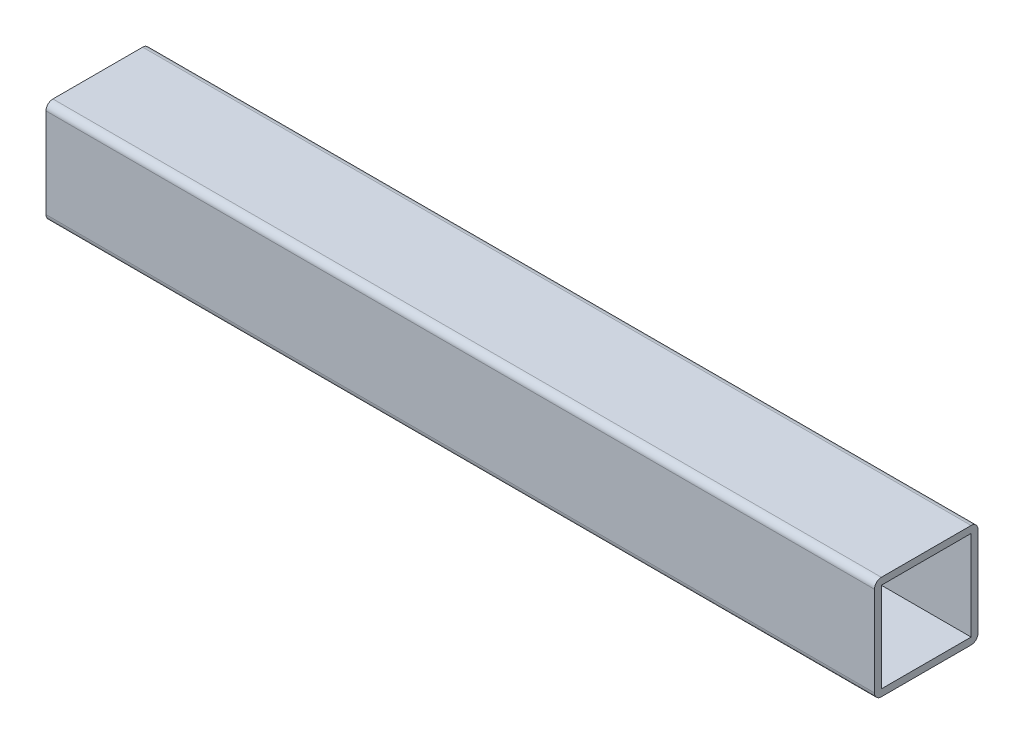
ISO-10303-21;
HEADER;
FILE_DESCRIPTION(('STEP AP214'),'2;1');
FILE_NAME('part.step','',(''),(''),'','','');
FILE_SCHEMA(('AUTOMOTIVE_DESIGN { 1 0 10303 214 1 1 1 1 }'));
ENDSEC;
DATA;
#1=APPLICATION_CONTEXT('core data for automotive mechanical design processes');
#2=APPLICATION_PROTOCOL_DEFINITION('international standard','automotive_design',2000,#1);
#3=PRODUCT_CONTEXT('',#1,'mechanical');
#4=PRODUCT('Part','Part','',(#3));
#5=PRODUCT_RELATED_PRODUCT_CATEGORY('part','',(#4));
#6=PRODUCT_DEFINITION_FORMATION('','',#4);
#7=PRODUCT_DEFINITION_CONTEXT('part definition',#1,'design');
#8=PRODUCT_DEFINITION('design','',#6,#7);
#9=PRODUCT_DEFINITION_SHAPE('','',#8);
#10=(LENGTH_UNIT() NAMED_UNIT(*) SI_UNIT(.MILLI.,.METRE.));
#11=(NAMED_UNIT(*) PLANE_ANGLE_UNIT() SI_UNIT($,.RADIAN.));
#12=(NAMED_UNIT(*) SI_UNIT($,.STERADIAN.) SOLID_ANGLE_UNIT());
#13=UNCERTAINTY_MEASURE_WITH_UNIT(LENGTH_MEASURE(1.E-05),#10,'distance_accuracy_value','');
#14=(GEOMETRIC_REPRESENTATION_CONTEXT(3) GLOBAL_UNCERTAINTY_ASSIGNED_CONTEXT((#13)) GLOBAL_UNIT_ASSIGNED_CONTEXT((#10,
#11,#12)) REPRESENTATION_CONTEXT('',''));
#15=CARTESIAN_POINT('',(0.,0.,0.));
#16=DIRECTION('',(0.,0.,1.));
#17=DIRECTION('',(1.,0.,0.));
#18=AXIS2_PLACEMENT_3D('',#15,#16,#17);
#19=CARTESIAN_POINT('',(1200.00000000001,140.,-9.99999999999979));
#20=DIRECTION('',(-1.00000000000001,0.,0.));
#21=DIRECTION('',(0.,0.,1.));
#22=AXIS2_PLACEMENT_3D('',#19,#20,#21);
#23=PLANE('',#22);
#24=CARTESIAN_POINT('',(1200.00000000001,140.,-9.99999999999979));
#25=DIRECTION('',(1.00000000000001,0.,0.));
#26=DIRECTION('',(0.,0.,1.));
#27=AXIS2_PLACEMENT_3D('',#24,#25,#26);
#28=CIRCLE('',#27,10.);
#29=CARTESIAN_POINT('',(1200.00000000001,150.,-10.0000000000001));
#30=VERTEX_POINT('',#29);
#31=CARTESIAN_POINT('',(1200.00000000001,140.000000000002,2.22044604925031E-13));
#32=VERTEX_POINT('',#31);
#33=EDGE_CURVE('E175',#30,#32,#28,.T.);
#34=ORIENTED_EDGE('',*,*,#33,.T.);
#35=DIRECTION('',(0.,-1.00000000000001,0.));
#36=VECTOR('',#35,1.);
#37=CARTESIAN_POINT('',(1200.00000000001,10.0000000000018,0.));
#38=LINE('',#37,#36);
#39=CARTESIAN_POINT('',(1200.00000000001,10.0000000000018,0.));
#40=VERTEX_POINT('',#39);
#41=EDGE_CURVE('E178',#32,#40,#38,.T.);
#42=ORIENTED_EDGE('',*,*,#41,.T.);
#43=CARTESIAN_POINT('',(1200.00000000001,10.,-10.));
#44=DIRECTION('',(1.00000000000001,0.,0.));
#45=DIRECTION('',(0.,0.,1.));
#46=AXIS2_PLACEMENT_3D('',#43,#44,#45);
#47=CIRCLE('',#46,10.);
#48=CARTESIAN_POINT('',(1200.00000000001,0.,-10.0000000000001));
#49=VERTEX_POINT('',#48);
#50=EDGE_CURVE('E180',#40,#49,#47,.T.);
#51=ORIENTED_EDGE('',*,*,#50,.T.);
#52=DIRECTION('',(0.,0.,-1.));
#53=VECTOR('',#52,1.);
#54=CARTESIAN_POINT('',(1200.00000000001,0.,-10.0000000000001));
#55=LINE('',#54,#53);
#56=CARTESIAN_POINT('',(1200.00000000001,-8.88178419700125E-13,-140.));
#57=VERTEX_POINT('',#56);
#58=EDGE_CURVE('E182',#49,#57,#55,.T.);
#59=ORIENTED_EDGE('',*,*,#58,.T.);
#60=CARTESIAN_POINT('',(1200.00000000001,9.99999999999912,-140.));
#61=DIRECTION('',(1.00000000000001,0.,0.));
#62=DIRECTION('',(0.,0.,-1.));
#63=AXIS2_PLACEMENT_3D('',#60,#61,#62);
#64=CIRCLE('',#63,10.);
#65=CARTESIAN_POINT('',(1200.00000000001,9.99999999999934,-150.));
#66=VERTEX_POINT('',#65);
#67=EDGE_CURVE('E184',#57,#66,#64,.T.);
#68=ORIENTED_EDGE('',*,*,#67,.T.);
#69=DIRECTION('',(0.,1.00000000000001,0.));
#70=VECTOR('',#69,1.);
#71=CARTESIAN_POINT('',(1200.00000000001,9.99999999999934,-150.));
#72=LINE('',#71,#70);
#73=CARTESIAN_POINT('',(1200.00000000001,140.,-150.));
#74=VERTEX_POINT('',#73);
#75=EDGE_CURVE('E186',#66,#74,#72,.T.);
#76=ORIENTED_EDGE('',*,*,#75,.T.);
#77=CARTESIAN_POINT('',(1200.00000000001,140.,-140.));
#78=DIRECTION('',(1.00000000000001,0.,0.));
#79=DIRECTION('',(0.,0.,-1.));
#80=AXIS2_PLACEMENT_3D('',#77,#78,#79);
#81=CIRCLE('',#80,10.);
#82=CARTESIAN_POINT('',(1200.00000000001,150.,-140.));
#83=VERTEX_POINT('',#82);
#84=EDGE_CURVE('E188',#74,#83,#81,.T.);
#85=ORIENTED_EDGE('',*,*,#84,.T.);
#86=DIRECTION('',(0.,0.,1.));
#87=VECTOR('',#86,1.);
#88=CARTESIAN_POINT('',(1200.00000000001,150.,-10.0000000000001));
#89=LINE('',#88,#87);
#90=EDGE_CURVE('E190',#83,#30,#89,.T.);
#91=ORIENTED_EDGE('',*,*,#90,.T.);
#92=EDGE_LOOP('',(#34,#42,#51,#59,#68,#76,#85,#91));
#93=FACE_BOUND('',#92,.T.);
#94=DIRECTION('',(0.,0.,-1.));
#95=VECTOR('',#94,1.);
#96=CARTESIAN_POINT('',(1200.00000000001,10.,-10.));
#97=LINE('',#96,#95);
#98=CARTESIAN_POINT('',(1200.00000000001,10.,-10.));
#99=VERTEX_POINT('',#98);
#100=CARTESIAN_POINT('',(1200.00000000001,9.99999999999912,-140.));
#101=VERTEX_POINT('',#100);
#102=EDGE_CURVE('E138',#99,#101,#97,.T.);
#103=ORIENTED_EDGE('',*,*,#102,.F.);
#104=DIRECTION('',(0.,-1.00000000000001,0.));
#105=VECTOR('',#104,1.);
#106=CARTESIAN_POINT('',(1200.00000000001,10.,-10.));
#107=LINE('',#106,#105);
#108=CARTESIAN_POINT('',(1200.00000000001,140.,-9.99999999999979));
#109=VERTEX_POINT('',#108);
#110=EDGE_CURVE('E153',#109,#99,#107,.T.);
#111=ORIENTED_EDGE('',*,*,#110,.F.);
#112=DIRECTION('',(0.,0.,1.));
#113=VECTOR('',#112,1.);
#114=CARTESIAN_POINT('',(1200.00000000001,140.,-9.99999999999979));
#115=LINE('',#114,#113);
#116=CARTESIAN_POINT('',(1200.00000000001,140.,-140.));
#117=VERTEX_POINT('',#116);
#118=EDGE_CURVE('E151',#117,#109,#115,.T.);
#119=ORIENTED_EDGE('',*,*,#118,.F.);
#120=DIRECTION('',(0.,1.00000000000001,0.));
#121=VECTOR('',#120,1.);
#122=CARTESIAN_POINT('',(1200.00000000001,9.99999999999912,-140.));
#123=LINE('',#122,#121);
#124=EDGE_CURVE('E149',#101,#117,#123,.T.);
#125=ORIENTED_EDGE('',*,*,#124,.F.);
#126=EDGE_LOOP('',(#103,#111,#119,#125));
#127=FACE_BOUND('',#126,.T.);
#128=ADVANCED_FACE('F34',(#93,#127),#23,.F.);
#129=CARTESIAN_POINT('',(0.,140.,-9.99999999999979));
#130=DIRECTION('',(-1.00000000000001,0.,0.));
#131=DIRECTION('',(0.,0.,1.));
#132=AXIS2_PLACEMENT_3D('',#129,#130,#131);
#133=PLANE('',#132);
#134=CARTESIAN_POINT('',(0.,140.,-9.99999999999979));
#135=DIRECTION('',(1.00000000000001,0.,0.));
#136=DIRECTION('',(0.,0.,1.));
#137=AXIS2_PLACEMENT_3D('',#134,#135,#136);
#138=CIRCLE('',#137,10.);
#139=CARTESIAN_POINT('',(-8.88178419700125E-13,150.,-10.0000000000001));
#140=VERTEX_POINT('',#139);
#141=CARTESIAN_POINT('',(-8.88178419700125E-13,140.,2.22044604925031E-13));
#142=VERTEX_POINT('',#141);
#143=EDGE_CURVE('E139',#140,#142,#138,.T.);
#144=ORIENTED_EDGE('',*,*,#143,.F.);
#145=DIRECTION('',(0.,0.,1.));
#146=VECTOR('',#145,1.);
#147=CARTESIAN_POINT('',(-8.88178419700125E-13,150.,-10.0000000000001));
#148=LINE('',#147,#146);
#149=CARTESIAN_POINT('',(-1.11022302462516E-12,150.000000000003,-140.));
#150=VERTEX_POINT('',#149);
#151=EDGE_CURVE('E173',#150,#140,#148,.T.);
#152=ORIENTED_EDGE('',*,*,#151,.F.);
#153=CARTESIAN_POINT('',(-8.88178419700125E-13,140.000000000003,-140.));
#154=DIRECTION('',(1.00000000000001,0.,0.));
#155=DIRECTION('',(0.,0.,-1.));
#156=AXIS2_PLACEMENT_3D('',#153,#154,#155);
#157=CIRCLE('',#156,10.);
#158=CARTESIAN_POINT('',(-8.88178419700125E-13,140.000000000003,-150.));
#159=VERTEX_POINT('',#158);
#160=EDGE_CURVE('E171',#159,#150,#157,.T.);
#161=ORIENTED_EDGE('',*,*,#160,.F.);
#162=DIRECTION('',(0.,1.00000000000001,0.));
#163=VECTOR('',#162,1.);
#164=CARTESIAN_POINT('',(-8.88178419700125E-13,10.0000000000027,-150.));
#165=LINE('',#164,#163);
#166=CARTESIAN_POINT('',(-8.88178419700125E-13,10.0000000000027,-150.));
#167=VERTEX_POINT('',#166);
#168=EDGE_CURVE('E169',#167,#159,#165,.T.);
#169=ORIENTED_EDGE('',*,*,#168,.F.);
#170=CARTESIAN_POINT('',(-6.66133814775094E-13,9.99999999999912,-140.));
#171=DIRECTION('',(1.00000000000001,0.,0.));
#172=DIRECTION('',(0.,0.,-1.));
#173=AXIS2_PLACEMENT_3D('',#170,#171,#172);
#174=CIRCLE('',#173,10.);
#175=CARTESIAN_POINT('',(-8.88178419700125E-13,-8.88178419700125E-13,-140.));
#176=VERTEX_POINT('',#175);
#177=EDGE_CURVE('E167',#176,#167,#174,.T.);
#178=ORIENTED_EDGE('',*,*,#177,.F.);
#179=DIRECTION('',(0.,0.,-1.));
#180=VECTOR('',#179,1.);
#181=CARTESIAN_POINT('',(0.,0.,-10.0000000000001));
#182=LINE('',#181,#180);
#183=CARTESIAN_POINT('',(0.,0.,-10.0000000000001));
#184=VERTEX_POINT('',#183);
#185=EDGE_CURVE('E165',#184,#176,#182,.T.);
#186=ORIENTED_EDGE('',*,*,#185,.F.);
#187=CARTESIAN_POINT('',(0.,10.,-10.));
#188=DIRECTION('',(1.00000000000001,0.,0.));
#189=DIRECTION('',(0.,0.,1.));
#190=AXIS2_PLACEMENT_3D('',#187,#188,#189);
#191=CIRCLE('',#190,10.);
#192=CARTESIAN_POINT('',(0.,10.,0.));
#193=VERTEX_POINT('',#192);
#194=EDGE_CURVE('E163',#193,#184,#191,.T.);
#195=ORIENTED_EDGE('',*,*,#194,.F.);
#196=DIRECTION('',(0.,-1.00000000000001,0.));
#197=VECTOR('',#196,1.);
#198=CARTESIAN_POINT('',(0.,10.,0.));
#199=LINE('',#198,#197);
#200=EDGE_CURVE('E161',#142,#193,#199,.T.);
#201=ORIENTED_EDGE('',*,*,#200,.F.);
#202=EDGE_LOOP('',(#144,#152,#161,#169,#178,#186,#195,#201));
#203=FACE_BOUND('',#202,.T.);
#204=DIRECTION('',(0.,-1.00000000000001,0.));
#205=VECTOR('',#204,1.);
#206=CARTESIAN_POINT('',(0.,10.,-10.));
#207=LINE('',#206,#205);
#208=CARTESIAN_POINT('',(0.,140.,-9.99999999999979));
#209=VERTEX_POINT('',#208);
#210=CARTESIAN_POINT('',(0.,10.,-10.));
#211=VERTEX_POINT('',#210);
#212=EDGE_CURVE('E143',#209,#211,#207,.T.);
#213=ORIENTED_EDGE('',*,*,#212,.T.);
#214=DIRECTION('',(0.,0.,-1.));
#215=VECTOR('',#214,1.);
#216=CARTESIAN_POINT('',(0.,10.,-10.));
#217=LINE('',#216,#215);
#218=CARTESIAN_POINT('',(-6.66133814775094E-13,9.99999999999912,-140.));
#219=VERTEX_POINT('',#218);
#220=EDGE_CURVE('E57',#211,#219,#217,.T.);
#221=ORIENTED_EDGE('',*,*,#220,.T.);
#222=DIRECTION('',(0.,1.00000000000001,0.));
#223=VECTOR('',#222,1.);
#224=CARTESIAN_POINT('',(-6.66133814775094E-13,9.99999999999912,-140.));
#225=LINE('',#224,#223);
#226=CARTESIAN_POINT('',(-8.88178419700125E-13,140.000000000003,-140.));
#227=VERTEX_POINT('',#226);
#228=EDGE_CURVE('E125',#219,#227,#225,.T.);
#229=ORIENTED_EDGE('',*,*,#228,.T.);
#230=DIRECTION('',(0.,0.,1.));
#231=VECTOR('',#230,1.);
#232=CARTESIAN_POINT('',(0.,140.,-9.99999999999979));
#233=LINE('',#232,#231);
#234=EDGE_CURVE('E134',#227,#209,#233,.T.);
#235=ORIENTED_EDGE('',*,*,#234,.T.);
#236=EDGE_LOOP('',(#213,#221,#229,#235));
#237=FACE_BOUND('',#236,.T.);
#238=ADVANCED_FACE('F142',(#203,#237),#133,.T.);
#239=CARTESIAN_POINT('',(1200.00000000001,140.,-9.99999999999979));
#240=DIRECTION('',(-1.00000000000001,0.,0.));
#241=DIRECTION('',(0.,0.,1.));
#242=AXIS2_PLACEMENT_3D('',#239,#240,#241);
#243=CYLINDRICAL_SURFACE('',#242,10.);
#244=ORIENTED_EDGE('',*,*,#143,.T.);
#245=DIRECTION('',(-1.00000000000001,0.,0.));
#246=VECTOR('',#245,1.);
#247=CARTESIAN_POINT('',(1200.00000000001,140.000000000002,2.22044604925031E-13));
#248=LINE('',#247,#246);
#249=EDGE_CURVE('E11',#32,#142,#248,.T.);
#250=ORIENTED_EDGE('',*,*,#249,.F.);
#251=ORIENTED_EDGE('',*,*,#33,.F.);
#252=DIRECTION('',(-1.00000000000001,0.,0.));
#253=VECTOR('',#252,1.);
#254=CARTESIAN_POINT('',(1200.00000000001,150.,-10.0000000000001));
#255=LINE('',#254,#253);
#256=EDGE_CURVE('E192',#30,#140,#255,.T.);
#257=ORIENTED_EDGE('',*,*,#256,.T.);
#258=EDGE_LOOP('',(#244,#250,#251,#257));
#259=FACE_BOUND('',#258,.T.);
#260=ADVANCED_FACE('F36',(#259),#243,.T.);
#261=CARTESIAN_POINT('',(1200.00000000001,10.0000000000018,0.));
#262=DIRECTION('',(0.,0.,-1.));
#263=DIRECTION('',(-1.00000000000001,0.,0.));
#264=AXIS2_PLACEMENT_3D('',#261,#262,#263);
#265=PLANE('',#264);
#266=ORIENTED_EDGE('',*,*,#200,.T.);
#267=DIRECTION('',(-1.00000000000001,0.,0.));
#268=VECTOR('',#267,1.);
#269=CARTESIAN_POINT('',(1200.00000000001,10.0000000000018,0.));
#270=LINE('',#269,#268);
#271=EDGE_CURVE('E42',#40,#193,#270,.T.);
#272=ORIENTED_EDGE('',*,*,#271,.F.);
#273=ORIENTED_EDGE('',*,*,#41,.F.);
#274=ORIENTED_EDGE('',*,*,#249,.T.);
#275=EDGE_LOOP('',(#266,#272,#273,#274));
#276=FACE_BOUND('',#275,.T.);
#277=ADVANCED_FACE('F236',(#276),#265,.F.);
#278=CARTESIAN_POINT('',(1200.00000000001,10.,-10.));
#279=DIRECTION('',(-1.00000000000001,0.,0.));
#280=DIRECTION('',(0.,0.,1.));
#281=AXIS2_PLACEMENT_3D('',#278,#279,#280);
#282=CYLINDRICAL_SURFACE('',#281,10.);
#283=ORIENTED_EDGE('',*,*,#194,.T.);
#284=DIRECTION('',(-1.00000000000001,0.,0.));
#285=VECTOR('',#284,1.);
#286=CARTESIAN_POINT('',(1200.00000000001,0.,-10.0000000000001));
#287=LINE('',#286,#285);
#288=EDGE_CURVE('E207',#49,#184,#287,.T.);
#289=ORIENTED_EDGE('',*,*,#288,.F.);
#290=ORIENTED_EDGE('',*,*,#50,.F.);
#291=ORIENTED_EDGE('',*,*,#271,.T.);
#292=EDGE_LOOP('',(#283,#289,#290,#291));
#293=FACE_BOUND('',#292,.T.);
#294=ADVANCED_FACE('F214',(#293),#282,.T.);
#295=CARTESIAN_POINT('',(1200.00000000001,0.,-10.0000000000001));
#296=DIRECTION('',(0.,1.00000000000001,0.));
#297=DIRECTION('',(0.,0.,1.));
#298=AXIS2_PLACEMENT_3D('',#295,#296,#297);
#299=PLANE('',#298);
#300=ORIENTED_EDGE('',*,*,#185,.T.);
#301=DIRECTION('',(-1.00000000000001,0.,0.));
#302=VECTOR('',#301,1.);
#303=CARTESIAN_POINT('',(1200.00000000001,-8.88178419700125E-13,-140.));
#304=LINE('',#303,#302);
#305=EDGE_CURVE('E204',#57,#176,#304,.T.);
#306=ORIENTED_EDGE('',*,*,#305,.F.);
#307=ORIENTED_EDGE('',*,*,#58,.F.);
#308=ORIENTED_EDGE('',*,*,#288,.T.);
#309=EDGE_LOOP('',(#300,#306,#307,#308));
#310=FACE_BOUND('',#309,.T.);
#311=ADVANCED_FACE('F224',(#310),#299,.F.);
#312=CARTESIAN_POINT('',(1200.00000000001,9.99999999999912,-140.));
#313=DIRECTION('',(-1.00000000000001,0.,0.));
#314=DIRECTION('',(0.,0.,1.));
#315=AXIS2_PLACEMENT_3D('',#312,#313,#314);
#316=CYLINDRICAL_SURFACE('',#315,10.);
#317=ORIENTED_EDGE('',*,*,#177,.T.);
#318=DIRECTION('',(-1.00000000000001,0.,0.));
#319=VECTOR('',#318,1.);
#320=CARTESIAN_POINT('',(1200.00000000001,9.99999999999934,-150.));
#321=LINE('',#320,#319);
#322=EDGE_CURVE('E201',#66,#167,#321,.T.);
#323=ORIENTED_EDGE('',*,*,#322,.F.);
#324=ORIENTED_EDGE('',*,*,#67,.F.);
#325=ORIENTED_EDGE('',*,*,#305,.T.);
#326=EDGE_LOOP('',(#317,#323,#324,#325));
#327=FACE_BOUND('',#326,.T.);
#328=ADVANCED_FACE('F228',(#327),#316,.T.);
#329=CARTESIAN_POINT('',(1200.00000000001,9.99999999999934,-150.));
#330=DIRECTION('',(0.,0.,1.));
#331=DIRECTION('',(1.00000000000001,0.,0.));
#332=AXIS2_PLACEMENT_3D('',#329,#330,#331);
#333=PLANE('',#332);
#334=ORIENTED_EDGE('',*,*,#168,.T.);
#335=DIRECTION('',(-1.00000000000001,0.,0.));
#336=VECTOR('',#335,1.);
#337=CARTESIAN_POINT('',(1200.00000000001,140.,-150.));
#338=LINE('',#337,#336);
#339=EDGE_CURVE('E198',#74,#159,#338,.T.);
#340=ORIENTED_EDGE('',*,*,#339,.F.);
#341=ORIENTED_EDGE('',*,*,#75,.F.);
#342=ORIENTED_EDGE('',*,*,#322,.T.);
#343=EDGE_LOOP('',(#334,#340,#341,#342));
#344=FACE_BOUND('',#343,.T.);
#345=ADVANCED_FACE('F249',(#344),#333,.F.);
#346=CARTESIAN_POINT('',(1200.00000000001,140.,-140.));
#347=DIRECTION('',(-1.00000000000001,0.,0.));
#348=DIRECTION('',(0.,0.,1.));
#349=AXIS2_PLACEMENT_3D('',#346,#347,#348);
#350=CYLINDRICAL_SURFACE('',#349,10.);
#351=ORIENTED_EDGE('',*,*,#160,.T.);
#352=DIRECTION('',(-1.00000000000001,0.,0.));
#353=VECTOR('',#352,1.);
#354=CARTESIAN_POINT('',(1200.00000000001,150.,-140.));
#355=LINE('',#354,#353);
#356=EDGE_CURVE('E195',#83,#150,#355,.T.);
#357=ORIENTED_EDGE('',*,*,#356,.F.);
#358=ORIENTED_EDGE('',*,*,#84,.F.);
#359=ORIENTED_EDGE('',*,*,#339,.T.);
#360=EDGE_LOOP('',(#351,#357,#358,#359));
#361=FACE_BOUND('',#360,.T.);
#362=ADVANCED_FACE('F247',(#361),#350,.T.);
#363=CARTESIAN_POINT('',(1200.00000000001,150.,-10.0000000000001));
#364=DIRECTION('',(0.,-1.00000000000001,0.));
#365=DIRECTION('',(0.,0.,-1.));
#366=AXIS2_PLACEMENT_3D('',#363,#364,#365);
#367=PLANE('',#366);
#368=ORIENTED_EDGE('',*,*,#151,.T.);
#369=ORIENTED_EDGE('',*,*,#256,.F.);
#370=ORIENTED_EDGE('',*,*,#90,.F.);
#371=ORIENTED_EDGE('',*,*,#356,.T.);
#372=EDGE_LOOP('',(#368,#369,#370,#371));
#373=FACE_BOUND('',#372,.T.);
#374=ADVANCED_FACE('F242',(#373),#367,.F.);
#375=CARTESIAN_POINT('',(1200.00000000001,10.,-10.));
#376=DIRECTION('',(0.,1.00000000000001,0.));
#377=DIRECTION('',(0.,0.,1.));
#378=AXIS2_PLACEMENT_3D('',#375,#376,#377);
#379=PLANE('',#378);
#380=ORIENTED_EDGE('',*,*,#220,.F.);
#381=DIRECTION('',(-1.00000000000001,0.,0.));
#382=VECTOR('',#381,1.);
#383=CARTESIAN_POINT('',(1200.00000000001,10.,-10.));
#384=LINE('',#383,#382);
#385=EDGE_CURVE('E155',#99,#211,#384,.T.);
#386=ORIENTED_EDGE('',*,*,#385,.F.);
#387=ORIENTED_EDGE('',*,*,#102,.T.);
#388=DIRECTION('',(-1.00000000000001,0.,0.));
#389=VECTOR('',#388,1.);
#390=CARTESIAN_POINT('',(1200.00000000001,9.99999999999912,-140.));
#391=LINE('',#390,#389);
#392=EDGE_CURVE('E127',#101,#219,#391,.T.);
#393=ORIENTED_EDGE('',*,*,#392,.T.);
#394=EDGE_LOOP('',(#380,#386,#387,#393));
#395=FACE_BOUND('',#394,.T.);
#396=ADVANCED_FACE('F136',(#395),#379,.T.);
#397=CARTESIAN_POINT('',(1200.00000000001,9.99999999999912,-140.));
#398=DIRECTION('',(0.,0.,1.));
#399=DIRECTION('',(1.00000000000001,0.,0.));
#400=AXIS2_PLACEMENT_3D('',#397,#398,#399);
#401=PLANE('',#400);
#402=ORIENTED_EDGE('',*,*,#228,.F.);
#403=ORIENTED_EDGE('',*,*,#392,.F.);
#404=ORIENTED_EDGE('',*,*,#124,.T.);
#405=DIRECTION('',(-1.00000000000001,0.,0.));
#406=VECTOR('',#405,1.);
#407=CARTESIAN_POINT('',(1200.00000000001,140.,-140.));
#408=LINE('',#407,#406);
#409=EDGE_CURVE('E130',#117,#227,#408,.T.);
#410=ORIENTED_EDGE('',*,*,#409,.T.);
#411=EDGE_LOOP('',(#402,#403,#404,#410));
#412=FACE_BOUND('',#411,.T.);
#413=ADVANCED_FACE('F126',(#412),#401,.T.);
#414=CARTESIAN_POINT('',(1200.00000000001,140.,-9.99999999999979));
#415=DIRECTION('',(0.,-1.00000000000001,0.));
#416=DIRECTION('',(0.,0.,-1.));
#417=AXIS2_PLACEMENT_3D('',#414,#415,#416);
#418=PLANE('',#417);
#419=ORIENTED_EDGE('',*,*,#234,.F.);
#420=ORIENTED_EDGE('',*,*,#409,.F.);
#421=ORIENTED_EDGE('',*,*,#118,.T.);
#422=DIRECTION('',(-1.00000000000001,0.,0.));
#423=VECTOR('',#422,1.);
#424=CARTESIAN_POINT('',(1200.00000000001,140.,-9.99999999999979));
#425=LINE('',#424,#423);
#426=EDGE_CURVE('E49',#109,#209,#425,.T.);
#427=ORIENTED_EDGE('',*,*,#426,.T.);
#428=EDGE_LOOP('',(#419,#420,#421,#427));
#429=FACE_BOUND('',#428,.T.);
#430=ADVANCED_FACE('F273',(#429),#418,.T.);
#431=CARTESIAN_POINT('',(1200.00000000001,10.,-10.));
#432=DIRECTION('',(0.,0.,-1.));
#433=DIRECTION('',(-1.00000000000001,0.,0.));
#434=AXIS2_PLACEMENT_3D('',#431,#432,#433);
#435=PLANE('',#434);
#436=ORIENTED_EDGE('',*,*,#212,.F.);
#437=ORIENTED_EDGE('',*,*,#426,.F.);
#438=ORIENTED_EDGE('',*,*,#110,.T.);
#439=ORIENTED_EDGE('',*,*,#385,.T.);
#440=EDGE_LOOP('',(#436,#437,#438,#439));
#441=FACE_BOUND('',#440,.T.);
#442=ADVANCED_FACE('F278',(#441),#435,.T.);
#443=CLOSED_SHELL('',(#128,#238,#260,#277,#294,#311,#328,#345,#362,#374,#396,#413,#430,#442));
#444=MANIFOLD_SOLID_BREP('B2',#443);
#445=ADVANCED_BREP_SHAPE_REPRESENTATION('',(#18,#444),#14);
#446=SHAPE_DEFINITION_REPRESENTATION(#9,#445);
ENDSEC;
END-ISO-10303-21;
